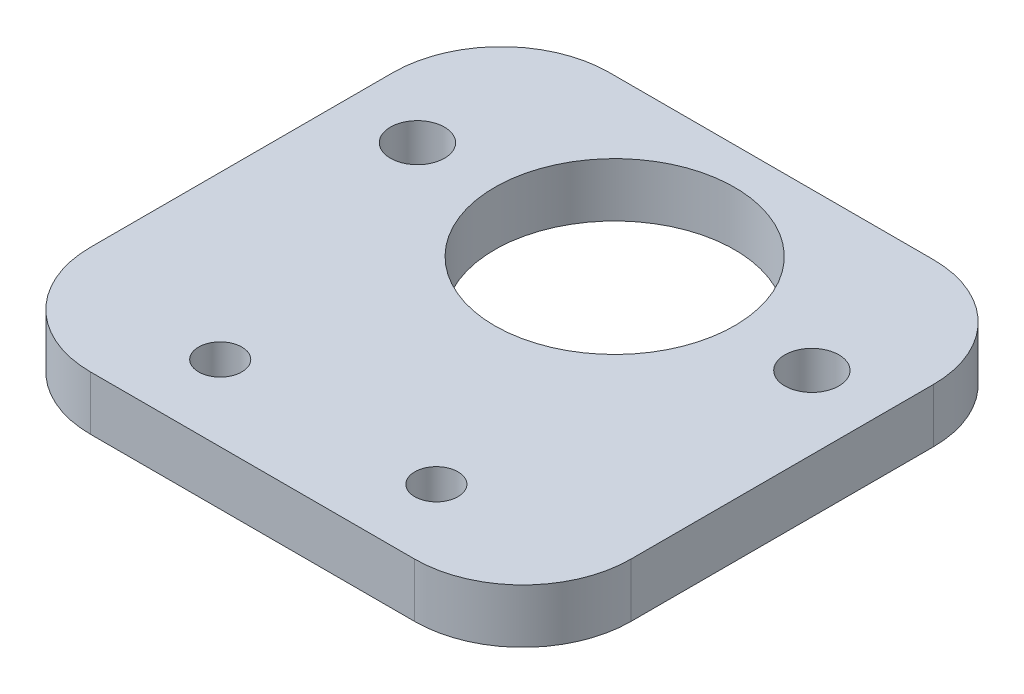
ISO-10303-21;
HEADER;
FILE_DESCRIPTION(('STEP AP214'),'2;1');
FILE_NAME('part.step','',(''),(''),'','','');
FILE_SCHEMA(('AUTOMOTIVE_DESIGN { 1 0 10303 214 1 1 1 1 }'));
ENDSEC;
DATA;
#1=APPLICATION_CONTEXT('core data for automotive mechanical design processes');
#2=APPLICATION_PROTOCOL_DEFINITION('international standard','automotive_design',2000,#1);
#3=PRODUCT_CONTEXT('',#1,'mechanical');
#4=PRODUCT('Part','Part','',(#3));
#5=PRODUCT_RELATED_PRODUCT_CATEGORY('part','',(#4));
#6=PRODUCT_DEFINITION_FORMATION('','',#4);
#7=PRODUCT_DEFINITION_CONTEXT('part definition',#1,'design');
#8=PRODUCT_DEFINITION('design','',#6,#7);
#9=PRODUCT_DEFINITION_SHAPE('','',#8);
#10=(LENGTH_UNIT() NAMED_UNIT(*) SI_UNIT(.MILLI.,.METRE.));
#11=(NAMED_UNIT(*) PLANE_ANGLE_UNIT() SI_UNIT($,.RADIAN.));
#12=(NAMED_UNIT(*) SI_UNIT($,.STERADIAN.) SOLID_ANGLE_UNIT());
#13=UNCERTAINTY_MEASURE_WITH_UNIT(LENGTH_MEASURE(1.E-05),#10,'distance_accuracy_value','');
#14=(GEOMETRIC_REPRESENTATION_CONTEXT(3) GLOBAL_UNCERTAINTY_ASSIGNED_CONTEXT((#13)) GLOBAL_UNIT_ASSIGNED_CONTEXT((#10,
#11,#12)) REPRESENTATION_CONTEXT('',''));
#15=CARTESIAN_POINT('',(0.,0.,0.));
#16=DIRECTION('',(0.,0.,1.));
#17=DIRECTION('',(1.,0.,0.));
#18=AXIS2_PLACEMENT_3D('',#15,#16,#17);
#19=CARTESIAN_POINT('',(10.,5.,-38.));
#20=DIRECTION('',(0.,1.,0.));
#21=DIRECTION('',(0.,0.,1.));
#22=AXIS2_PLACEMENT_3D('',#19,#20,#21);
#23=CYLINDRICAL_SURFACE('',#22,10.);
#24=DIRECTION('',(0.,1.,0.));
#25=VECTOR('',#24,1.);
#26=CARTESIAN_POINT('',(10.,5.,-48.));
#27=LINE('',#26,#25);
#28=CARTESIAN_POINT('',(10.,0.,-48.));
#29=VERTEX_POINT('',#28);
#30=CARTESIAN_POINT('',(10.,5.,-48.));
#31=VERTEX_POINT('',#30);
#32=EDGE_CURVE('E150',#29,#31,#27,.T.);
#33=ORIENTED_EDGE('',*,*,#32,.F.);
#34=CARTESIAN_POINT('',(10.,0.,-38.));
#35=DIRECTION('',(0.,-1.,0.));
#36=DIRECTION('',(0.,0.,-1.));
#37=AXIS2_PLACEMENT_3D('',#34,#35,#36);
#38=CIRCLE('',#37,10.);
#39=CARTESIAN_POINT('',(0.,0.,-38.));
#40=VERTEX_POINT('',#39);
#41=EDGE_CURVE('E40',#40,#29,#38,.T.);
#42=ORIENTED_EDGE('',*,*,#41,.F.);
#43=DIRECTION('',(0.,1.,0.));
#44=VECTOR('',#43,1.);
#45=CARTESIAN_POINT('',(0.,5.,-38.));
#46=LINE('',#45,#44);
#47=CARTESIAN_POINT('',(0.,5.,-38.));
#48=VERTEX_POINT('',#47);
#49=EDGE_CURVE('E153',#48,#40,#46,.F.);
#50=ORIENTED_EDGE('',*,*,#49,.F.);
#51=CARTESIAN_POINT('',(10.,5.,-38.));
#52=DIRECTION('',(0.,-1.,0.));
#53=DIRECTION('',(0.,0.,-1.));
#54=AXIS2_PLACEMENT_3D('',#51,#52,#53);
#55=CIRCLE('',#54,10.);
#56=EDGE_CURVE('E11',#31,#48,#55,.F.);
#57=ORIENTED_EDGE('',*,*,#56,.F.);
#58=EDGE_LOOP('',(#33,#42,#50,#57));
#59=FACE_BOUND('',#58,.T.);
#60=ADVANCED_FACE('F32',(#59),#23,.T.);
#61=CARTESIAN_POINT('',(40.,5.,-38.));
#62=DIRECTION('',(0.,-1.,0.));
#63=DIRECTION('',(0.,0.,-1.));
#64=AXIS2_PLACEMENT_3D('',#61,#62,#63);
#65=CYLINDRICAL_SURFACE('',#64,10.);
#66=DIRECTION('',(0.,-1.,0.));
#67=VECTOR('',#66,1.);
#68=CARTESIAN_POINT('',(40.,5.,-48.));
#69=LINE('',#68,#67);
#70=CARTESIAN_POINT('',(40.,5.,-48.));
#71=VERTEX_POINT('',#70);
#72=CARTESIAN_POINT('',(40.,0.,-48.));
#73=VERTEX_POINT('',#72);
#74=EDGE_CURVE('E140',#71,#73,#69,.T.);
#75=ORIENTED_EDGE('',*,*,#74,.F.);
#76=CARTESIAN_POINT('',(40.,5.,-38.));
#77=DIRECTION('',(0.,-1.,0.));
#78=DIRECTION('',(0.,0.,-1.));
#79=AXIS2_PLACEMENT_3D('',#76,#77,#78);
#80=CIRCLE('',#79,10.);
#81=CARTESIAN_POINT('',(50.,5.,-38.));
#82=VERTEX_POINT('',#81);
#83=EDGE_CURVE('E146',#82,#71,#80,.F.);
#84=ORIENTED_EDGE('',*,*,#83,.F.);
#85=DIRECTION('',(0.,-1.,0.));
#86=VECTOR('',#85,1.);
#87=CARTESIAN_POINT('',(50.,5.,-38.));
#88=LINE('',#87,#86);
#89=CARTESIAN_POINT('',(50.,0.,-38.));
#90=VERTEX_POINT('',#89);
#91=EDGE_CURVE('E143',#90,#82,#88,.F.);
#92=ORIENTED_EDGE('',*,*,#91,.F.);
#93=CARTESIAN_POINT('',(40.,0.,-38.));
#94=DIRECTION('',(0.,-1.,0.));
#95=DIRECTION('',(0.,0.,-1.));
#96=AXIS2_PLACEMENT_3D('',#93,#94,#95);
#97=CIRCLE('',#96,10.);
#98=EDGE_CURVE('E148',#73,#90,#97,.T.);
#99=ORIENTED_EDGE('',*,*,#98,.F.);
#100=EDGE_LOOP('',(#75,#84,#92,#99));
#101=FACE_BOUND('',#100,.T.);
#102=ADVANCED_FACE('F211',(#101),#65,.T.);
#103=CARTESIAN_POINT('',(10.,5.,-10.));
#104=DIRECTION('',(0.,1.,0.));
#105=DIRECTION('',(0.,0.,1.));
#106=AXIS2_PLACEMENT_3D('',#103,#104,#105);
#107=CYLINDRICAL_SURFACE('',#106,10.);
#108=DIRECTION('',(0.,1.,0.));
#109=VECTOR('',#108,1.);
#110=CARTESIAN_POINT('',(0.,5.,-10.));
#111=LINE('',#110,#109);
#112=CARTESIAN_POINT('',(0.,0.,-10.));
#113=VERTEX_POINT('',#112);
#114=CARTESIAN_POINT('',(0.,5.,-10.));
#115=VERTEX_POINT('',#114);
#116=EDGE_CURVE('E132',#113,#115,#111,.T.);
#117=ORIENTED_EDGE('',*,*,#116,.F.);
#118=CARTESIAN_POINT('',(10.,0.,-10.));
#119=DIRECTION('',(0.,-1.,0.));
#120=DIRECTION('',(0.,0.,-1.));
#121=AXIS2_PLACEMENT_3D('',#118,#119,#120);
#122=CIRCLE('',#121,10.);
#123=CARTESIAN_POINT('',(10.,0.,0.));
#124=VERTEX_POINT('',#123);
#125=EDGE_CURVE('E136',#124,#113,#122,.T.);
#126=ORIENTED_EDGE('',*,*,#125,.F.);
#127=DIRECTION('',(0.,1.,0.));
#128=VECTOR('',#127,1.);
#129=CARTESIAN_POINT('',(10.,5.,0.));
#130=LINE('',#129,#128);
#131=CARTESIAN_POINT('',(10.,5.,0.));
#132=VERTEX_POINT('',#131);
#133=EDGE_CURVE('E103',#132,#124,#130,.F.);
#134=ORIENTED_EDGE('',*,*,#133,.F.);
#135=CARTESIAN_POINT('',(10.,5.,-10.));
#136=DIRECTION('',(0.,-1.,0.));
#137=DIRECTION('',(0.,0.,-1.));
#138=AXIS2_PLACEMENT_3D('',#135,#136,#137);
#139=CIRCLE('',#138,10.);
#140=EDGE_CURVE('E138',#115,#132,#139,.F.);
#141=ORIENTED_EDGE('',*,*,#140,.F.);
#142=EDGE_LOOP('',(#117,#126,#134,#141));
#143=FACE_BOUND('',#142,.T.);
#144=ADVANCED_FACE('F207',(#143),#107,.T.);
#145=CARTESIAN_POINT('',(40.,5.,-10.));
#146=DIRECTION('',(0.,1.,0.));
#147=DIRECTION('',(0.,0.,1.));
#148=AXIS2_PLACEMENT_3D('',#145,#146,#147);
#149=CYLINDRICAL_SURFACE('',#148,10.);
#150=DIRECTION('',(0.,1.,0.));
#151=VECTOR('',#150,1.);
#152=CARTESIAN_POINT('',(40.,5.,0.));
#153=LINE('',#152,#151);
#154=CARTESIAN_POINT('',(40.,0.,0.));
#155=VERTEX_POINT('',#154);
#156=CARTESIAN_POINT('',(40.,5.,0.));
#157=VERTEX_POINT('',#156);
#158=EDGE_CURVE('E101',#155,#157,#153,.T.);
#159=ORIENTED_EDGE('',*,*,#158,.F.);
#160=CARTESIAN_POINT('',(40.,0.,-10.));
#161=DIRECTION('',(0.,-1.,0.));
#162=DIRECTION('',(0.,0.,-1.));
#163=AXIS2_PLACEMENT_3D('',#160,#161,#162);
#164=CIRCLE('',#163,10.);
#165=CARTESIAN_POINT('',(50.,0.,-10.));
#166=VERTEX_POINT('',#165);
#167=EDGE_CURVE('E110',#166,#155,#164,.T.);
#168=ORIENTED_EDGE('',*,*,#167,.F.);
#169=DIRECTION('',(0.,1.,0.));
#170=VECTOR('',#169,1.);
#171=CARTESIAN_POINT('',(50.,5.,-10.));
#172=LINE('',#171,#170);
#173=CARTESIAN_POINT('',(50.,5.,-10.));
#174=VERTEX_POINT('',#173);
#175=EDGE_CURVE('E118',#174,#166,#172,.F.);
#176=ORIENTED_EDGE('',*,*,#175,.F.);
#177=CARTESIAN_POINT('',(40.,5.,-10.));
#178=DIRECTION('',(0.,-1.,0.));
#179=DIRECTION('',(0.,0.,-1.));
#180=AXIS2_PLACEMENT_3D('',#177,#178,#179);
#181=CIRCLE('',#180,10.);
#182=EDGE_CURVE('E117',#157,#174,#181,.F.);
#183=ORIENTED_EDGE('',*,*,#182,.F.);
#184=EDGE_LOOP('',(#159,#168,#176,#183));
#185=FACE_BOUND('',#184,.T.);
#186=ADVANCED_FACE('F121',(#185),#149,.T.);
#187=CARTESIAN_POINT('',(0.,5.,0.));
#188=DIRECTION('',(1.,0.,0.));
#189=DIRECTION('',(0.,0.,-1.));
#190=AXIS2_PLACEMENT_3D('',#187,#188,#189);
#191=PLANE('',#190);
#192=DIRECTION('',(0.,0.,1.));
#193=VECTOR('',#192,1.);
#194=CARTESIAN_POINT('',(0.,5.,0.));
#195=LINE('',#194,#193);
#196=EDGE_CURVE('E186',#48,#115,#195,.T.);
#197=ORIENTED_EDGE('',*,*,#196,.F.);
#198=ORIENTED_EDGE('',*,*,#49,.T.);
#199=DIRECTION('',(0.,0.,1.));
#200=VECTOR('',#199,1.);
#201=CARTESIAN_POINT('',(0.,0.,0.));
#202=LINE('',#201,#200);
#203=EDGE_CURVE('E107',#40,#113,#202,.T.);
#204=ORIENTED_EDGE('',*,*,#203,.T.);
#205=ORIENTED_EDGE('',*,*,#116,.T.);
#206=EDGE_LOOP('',(#197,#198,#204,#205));
#207=FACE_BOUND('',#206,.T.);
#208=ADVANCED_FACE('F202',(#207),#191,.F.);
#209=CARTESIAN_POINT('',(0.,5.,0.));
#210=DIRECTION('',(0.,0.,-1.));
#211=DIRECTION('',(-1.,0.,0.));
#212=AXIS2_PLACEMENT_3D('',#209,#210,#211);
#213=PLANE('',#212);
#214=DIRECTION('',(1.,0.,0.));
#215=VECTOR('',#214,1.);
#216=CARTESIAN_POINT('',(0.,5.,0.));
#217=LINE('',#216,#215);
#218=EDGE_CURVE('E188',#132,#157,#217,.T.);
#219=ORIENTED_EDGE('',*,*,#218,.F.);
#220=ORIENTED_EDGE('',*,*,#133,.T.);
#221=DIRECTION('',(1.,0.,0.));
#222=VECTOR('',#221,1.);
#223=CARTESIAN_POINT('',(0.,0.,0.));
#224=LINE('',#223,#222);
#225=EDGE_CURVE('E96',#124,#155,#224,.T.);
#226=ORIENTED_EDGE('',*,*,#225,.T.);
#227=ORIENTED_EDGE('',*,*,#158,.T.);
#228=EDGE_LOOP('',(#219,#220,#226,#227));
#229=FACE_BOUND('',#228,.T.);
#230=ADVANCED_FACE('F99',(#229),#213,.F.);
#231=CARTESIAN_POINT('',(50.,5.,0.));
#232=DIRECTION('',(-1.,0.,0.));
#233=DIRECTION('',(0.,0.,1.));
#234=AXIS2_PLACEMENT_3D('',#231,#232,#233);
#235=PLANE('',#234);
#236=DIRECTION('',(0.,0.,-1.));
#237=VECTOR('',#236,1.);
#238=CARTESIAN_POINT('',(50.,0.,0.));
#239=LINE('',#238,#237);
#240=EDGE_CURVE('E106',#166,#90,#239,.T.);
#241=ORIENTED_EDGE('',*,*,#240,.T.);
#242=ORIENTED_EDGE('',*,*,#91,.T.);
#243=DIRECTION('',(0.,0.,-1.));
#244=VECTOR('',#243,1.);
#245=CARTESIAN_POINT('',(50.,5.,0.));
#246=LINE('',#245,#244);
#247=EDGE_CURVE('E125',#174,#82,#246,.T.);
#248=ORIENTED_EDGE('',*,*,#247,.F.);
#249=ORIENTED_EDGE('',*,*,#175,.T.);
#250=EDGE_LOOP('',(#241,#242,#248,#249));
#251=FACE_BOUND('',#250,.T.);
#252=ADVANCED_FACE('F209',(#251),#235,.F.);
#253=CARTESIAN_POINT('',(0.,5.,-48.));
#254=DIRECTION('',(0.,0.,1.));
#255=DIRECTION('',(1.,0.,0.));
#256=AXIS2_PLACEMENT_3D('',#253,#254,#255);
#257=PLANE('',#256);
#258=DIRECTION('',(-1.,0.,0.));
#259=VECTOR('',#258,1.);
#260=CARTESIAN_POINT('',(0.,0.,-48.));
#261=LINE('',#260,#259);
#262=EDGE_CURVE('E128',#73,#29,#261,.T.);
#263=ORIENTED_EDGE('',*,*,#262,.T.);
#264=ORIENTED_EDGE('',*,*,#32,.T.);
#265=DIRECTION('',(-1.,0.,0.));
#266=VECTOR('',#265,1.);
#267=CARTESIAN_POINT('',(0.,5.,-48.));
#268=LINE('',#267,#266);
#269=EDGE_CURVE('E122',#71,#31,#268,.T.);
#270=ORIENTED_EDGE('',*,*,#269,.F.);
#271=ORIENTED_EDGE('',*,*,#74,.T.);
#272=EDGE_LOOP('',(#263,#264,#270,#271));
#273=FACE_BOUND('',#272,.T.);
#274=ADVANCED_FACE('F196',(#273),#257,.F.);
#275=CARTESIAN_POINT('',(0.,5.,0.));
#276=DIRECTION('',(0.,-1.,0.));
#277=DIRECTION('',(0.,0.,-1.));
#278=AXIS2_PLACEMENT_3D('',#275,#276,#277);
#279=PLANE('',#278);
#280=CARTESIAN_POINT('',(35.,5.,-7.));
#281=DIRECTION('',(0.,1.,0.));
#282=DIRECTION('',(0.,0.,-1.));
#283=AXIS2_PLACEMENT_3D('',#280,#281,#282);
#284=CIRCLE('',#283,2.);
#285=CARTESIAN_POINT('',(35.,5.,-9.));
#286=VERTEX_POINT('',#285);
#287=EDGE_CURVE('E169',#286,#286,#284,.T.);
#288=ORIENTED_EDGE('',*,*,#287,.F.);
#289=EDGE_LOOP('',(#288));
#290=FACE_BOUND('',#289,.T.);
#291=CARTESIAN_POINT('',(15.,5.,-7.));
#292=DIRECTION('',(0.,1.,0.));
#293=DIRECTION('',(0.,0.,1.));
#294=AXIS2_PLACEMENT_3D('',#291,#292,#293);
#295=CIRCLE('',#294,2.);
#296=CARTESIAN_POINT('',(15.,5.,-5.));
#297=VERTEX_POINT('',#296);
#298=EDGE_CURVE('E158',#297,#297,#295,.T.);
#299=ORIENTED_EDGE('',*,*,#298,.F.);
#300=EDGE_LOOP('',(#299));
#301=FACE_BOUND('',#300,.T.);
#302=CARTESIAN_POINT('',(6.74999999999999,5.,-33.5));
#303=DIRECTION('',(0.,1.,0.));
#304=DIRECTION('',(0.,0.,1.));
#305=AXIS2_PLACEMENT_3D('',#302,#303,#304);
#306=CIRCLE('',#305,2.5);
#307=CARTESIAN_POINT('',(6.74999999999999,5.,-31.));
#308=VERTEX_POINT('',#307);
#309=EDGE_CURVE('E176',#308,#308,#306,.T.);
#310=ORIENTED_EDGE('',*,*,#309,.F.);
#311=EDGE_LOOP('',(#310));
#312=FACE_BOUND('',#311,.T.);
#313=CARTESIAN_POINT('',(43.25,5.,-33.5));
#314=DIRECTION('',(0.,1.,0.));
#315=DIRECTION('',(0.,0.,-1.));
#316=AXIS2_PLACEMENT_3D('',#313,#314,#315);
#317=CIRCLE('',#316,2.5);
#318=CARTESIAN_POINT('',(43.25,5.,-36.));
#319=VERTEX_POINT('',#318);
#320=EDGE_CURVE('E157',#319,#319,#317,.T.);
#321=ORIENTED_EDGE('',*,*,#320,.F.);
#322=EDGE_LOOP('',(#321));
#323=FACE_BOUND('',#322,.T.);
#324=CARTESIAN_POINT('',(25.,5.,-33.5));
#325=DIRECTION('',(0.,1.,0.));
#326=DIRECTION('',(0.,0.,1.));
#327=AXIS2_PLACEMENT_3D('',#324,#325,#326);
#328=CIRCLE('',#327,11.1);
#329=CARTESIAN_POINT('',(25.,5.,-22.4));
#330=VERTEX_POINT('',#329);
#331=EDGE_CURVE('E175',#330,#330,#328,.T.);
#332=ORIENTED_EDGE('',*,*,#331,.F.);
#333=EDGE_LOOP('',(#332));
#334=FACE_BOUND('',#333,.T.);
#335=ORIENTED_EDGE('',*,*,#269,.T.);
#336=ORIENTED_EDGE('',*,*,#56,.T.);
#337=ORIENTED_EDGE('',*,*,#196,.T.);
#338=ORIENTED_EDGE('',*,*,#140,.T.);
#339=ORIENTED_EDGE('',*,*,#218,.T.);
#340=ORIENTED_EDGE('',*,*,#182,.T.);
#341=ORIENTED_EDGE('',*,*,#247,.T.);
#342=ORIENTED_EDGE('',*,*,#83,.T.);
#343=EDGE_LOOP('',(#335,#336,#337,#338,#339,#340,#341,#342));
#344=FACE_BOUND('',#343,.T.);
#345=ADVANCED_FACE('F205',(#290,#301,#312,#323,#334,#344),#279,.F.);
#346=CARTESIAN_POINT('',(0.,0.,0.));
#347=DIRECTION('',(0.,-1.,0.));
#348=DIRECTION('',(0.,0.,-1.));
#349=AXIS2_PLACEMENT_3D('',#346,#347,#348);
#350=PLANE('',#349);
#351=CARTESIAN_POINT('',(35.,0.,-7.));
#352=DIRECTION('',(0.,-1.,0.));
#353=DIRECTION('',(0.,0.,-1.));
#354=AXIS2_PLACEMENT_3D('',#351,#352,#353);
#355=CIRCLE('',#354,2.);
#356=CARTESIAN_POINT('',(35.,0.,-9.));
#357=VERTEX_POINT('',#356);
#358=EDGE_CURVE('E35',#357,#357,#355,.T.);
#359=ORIENTED_EDGE('',*,*,#358,.F.);
#360=EDGE_LOOP('',(#359));
#361=FACE_BOUND('',#360,.T.);
#362=CARTESIAN_POINT('',(15.,0.,-7.));
#363=DIRECTION('',(0.,-1.,0.));
#364=DIRECTION('',(0.,0.,-1.));
#365=AXIS2_PLACEMENT_3D('',#362,#363,#364);
#366=CIRCLE('',#365,2.);
#367=CARTESIAN_POINT('',(15.,0.,-9.));
#368=VERTEX_POINT('',#367);
#369=EDGE_CURVE('E155',#368,#368,#366,.T.);
#370=ORIENTED_EDGE('',*,*,#369,.F.);
#371=EDGE_LOOP('',(#370));
#372=FACE_BOUND('',#371,.T.);
#373=CARTESIAN_POINT('',(6.74999999999999,0.,-33.5));
#374=DIRECTION('',(0.,1.,0.));
#375=DIRECTION('',(0.,0.,1.));
#376=AXIS2_PLACEMENT_3D('',#373,#374,#375);
#377=CIRCLE('',#376,2.5);
#378=CARTESIAN_POINT('',(6.74999999999999,0.,-31.));
#379=VERTEX_POINT('',#378);
#380=EDGE_CURVE('E172',#379,#379,#377,.T.);
#381=ORIENTED_EDGE('',*,*,#380,.T.);
#382=EDGE_LOOP('',(#381));
#383=FACE_BOUND('',#382,.T.);
#384=CARTESIAN_POINT('',(43.25,0.,-33.5));
#385=DIRECTION('',(0.,1.,0.));
#386=DIRECTION('',(0.,0.,-1.));
#387=AXIS2_PLACEMENT_3D('',#384,#385,#386);
#388=CIRCLE('',#387,2.5);
#389=CARTESIAN_POINT('',(43.25,0.,-36.));
#390=VERTEX_POINT('',#389);
#391=EDGE_CURVE('E162',#390,#390,#388,.T.);
#392=ORIENTED_EDGE('',*,*,#391,.T.);
#393=EDGE_LOOP('',(#392));
#394=FACE_BOUND('',#393,.T.);
#395=CARTESIAN_POINT('',(25.,0.,-33.5));
#396=DIRECTION('',(0.,1.,0.));
#397=DIRECTION('',(0.,0.,1.));
#398=AXIS2_PLACEMENT_3D('',#395,#396,#397);
#399=CIRCLE('',#398,11.1);
#400=CARTESIAN_POINT('',(25.,0.,-22.4));
#401=VERTEX_POINT('',#400);
#402=EDGE_CURVE('E181',#401,#401,#399,.T.);
#403=ORIENTED_EDGE('',*,*,#402,.T.);
#404=EDGE_LOOP('',(#403));
#405=FACE_BOUND('',#404,.T.);
#406=ORIENTED_EDGE('',*,*,#203,.F.);
#407=ORIENTED_EDGE('',*,*,#41,.T.);
#408=ORIENTED_EDGE('',*,*,#262,.F.);
#409=ORIENTED_EDGE('',*,*,#98,.T.);
#410=ORIENTED_EDGE('',*,*,#240,.F.);
#411=ORIENTED_EDGE('',*,*,#167,.T.);
#412=ORIENTED_EDGE('',*,*,#225,.F.);
#413=ORIENTED_EDGE('',*,*,#125,.T.);
#414=EDGE_LOOP('',(#406,#407,#408,#409,#410,#411,#412,#413));
#415=FACE_BOUND('',#414,.T.);
#416=ADVANCED_FACE('F112',(#361,#372,#383,#394,#405,#415),#350,.T.);
#417=CARTESIAN_POINT('',(25.,0.,-33.5));
#418=DIRECTION('',(0.,1.,0.));
#419=DIRECTION('',(0.,0.,1.));
#420=AXIS2_PLACEMENT_3D('',#417,#418,#419);
#421=CYLINDRICAL_SURFACE('',#420,11.1);
#422=ORIENTED_EDGE('',*,*,#402,.F.);
#423=EDGE_LOOP('',(#422));
#424=FACE_BOUND('',#423,.T.);
#425=ORIENTED_EDGE('',*,*,#331,.T.);
#426=EDGE_LOOP('',(#425));
#427=FACE_BOUND('',#426,.T.);
#428=ADVANCED_FACE('F232',(#424,#427),#421,.F.);
#429=CARTESIAN_POINT('',(43.25,0.,-33.5));
#430=DIRECTION('',(0.,1.,0.));
#431=DIRECTION('',(0.,0.,1.));
#432=AXIS2_PLACEMENT_3D('',#429,#430,#431);
#433=CYLINDRICAL_SURFACE('',#432,2.5);
#434=ORIENTED_EDGE('',*,*,#391,.F.);
#435=EDGE_LOOP('',(#434));
#436=FACE_BOUND('',#435,.T.);
#437=ORIENTED_EDGE('',*,*,#320,.T.);
#438=EDGE_LOOP('',(#437));
#439=FACE_BOUND('',#438,.T.);
#440=ADVANCED_FACE('F239',(#436,#439),#433,.F.);
#441=CARTESIAN_POINT('',(6.74999999999999,0.,-33.5));
#442=DIRECTION('',(0.,1.,0.));
#443=DIRECTION('',(0.,0.,1.));
#444=AXIS2_PLACEMENT_3D('',#441,#442,#443);
#445=CYLINDRICAL_SURFACE('',#444,2.5);
#446=ORIENTED_EDGE('',*,*,#380,.F.);
#447=EDGE_LOOP('',(#446));
#448=FACE_BOUND('',#447,.T.);
#449=ORIENTED_EDGE('',*,*,#309,.T.);
#450=EDGE_LOOP('',(#449));
#451=FACE_BOUND('',#450,.T.);
#452=ADVANCED_FACE('F243',(#448,#451),#445,.F.);
#453=CARTESIAN_POINT('',(15.,-17.,-7.));
#454=DIRECTION('',(0.,1.,0.));
#455=DIRECTION('',(0.,0.,1.));
#456=AXIS2_PLACEMENT_3D('',#453,#454,#455);
#457=CYLINDRICAL_SURFACE('',#456,2.);
#458=ORIENTED_EDGE('',*,*,#369,.T.);
#459=EDGE_LOOP('',(#458));
#460=FACE_BOUND('',#459,.T.);
#461=ORIENTED_EDGE('',*,*,#298,.T.);
#462=EDGE_LOOP('',(#461));
#463=FACE_BOUND('',#462,.T.);
#464=ADVANCED_FACE('F246',(#460,#463),#457,.F.);
#465=CARTESIAN_POINT('',(35.,-17.,-7.));
#466=DIRECTION('',(0.,1.,0.));
#467=DIRECTION('',(0.,0.,1.));
#468=AXIS2_PLACEMENT_3D('',#465,#466,#467);
#469=CYLINDRICAL_SURFACE('',#468,2.);
#470=ORIENTED_EDGE('',*,*,#358,.T.);
#471=EDGE_LOOP('',(#470));
#472=FACE_BOUND('',#471,.T.);
#473=ORIENTED_EDGE('',*,*,#287,.T.);
#474=EDGE_LOOP('',(#473));
#475=FACE_BOUND('',#474,.T.);
#476=ADVANCED_FACE('F250',(#472,#475),#469,.F.);
#477=CLOSED_SHELL('',(#60,#102,#144,#186,#208,#230,#252,#274,#345,#416,#428,#440,#452,#464,#476));
#478=MANIFOLD_SOLID_BREP('B2',#477);
#479=ADVANCED_BREP_SHAPE_REPRESENTATION('',(#18,#478),#14);
#480=SHAPE_DEFINITION_REPRESENTATION(#9,#479);
ENDSEC;
END-ISO-10303-21;
